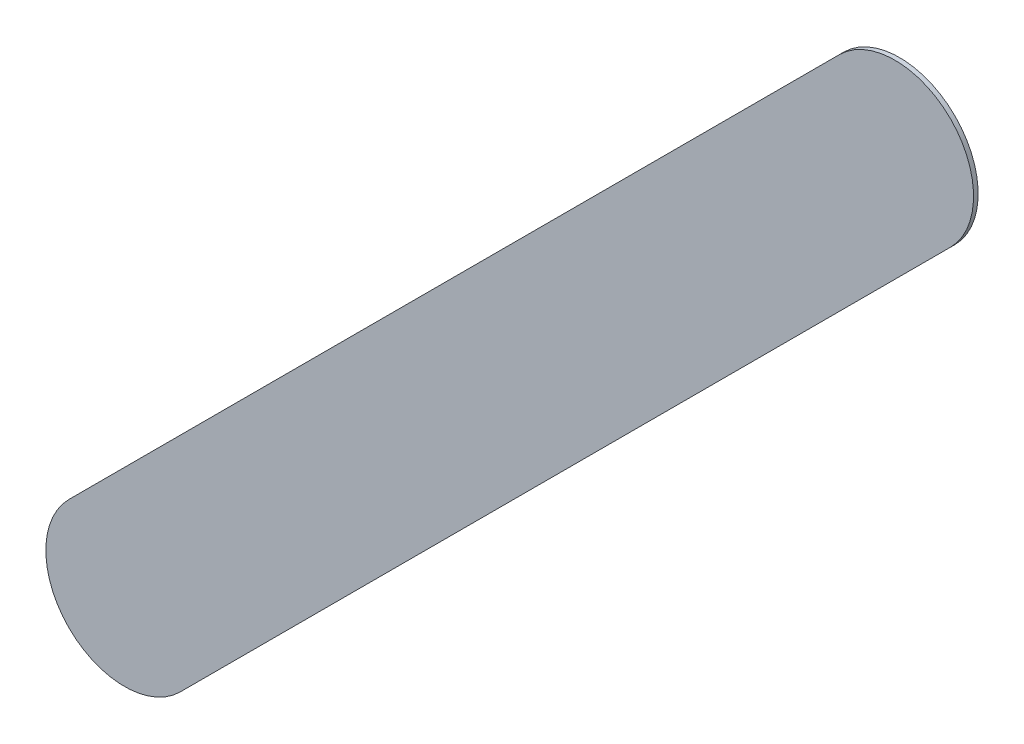
ISO-10303-21;
HEADER;
FILE_DESCRIPTION(('STEP AP214'),'2;1');
FILE_NAME('part.step','',(''),(''),'','','');
FILE_SCHEMA(('AUTOMOTIVE_DESIGN { 1 0 10303 214 1 1 1 1 }'));
ENDSEC;
DATA;
#1=APPLICATION_CONTEXT('core data for automotive mechanical design processes');
#2=APPLICATION_PROTOCOL_DEFINITION('international standard','automotive_design',2000,#1);
#3=PRODUCT_CONTEXT('',#1,'mechanical');
#4=PRODUCT('Part','Part','',(#3));
#5=PRODUCT_RELATED_PRODUCT_CATEGORY('part','',(#4));
#6=PRODUCT_DEFINITION_FORMATION('','',#4);
#7=PRODUCT_DEFINITION_CONTEXT('part definition',#1,'design');
#8=PRODUCT_DEFINITION('design','',#6,#7);
#9=PRODUCT_DEFINITION_SHAPE('','',#8);
#10=(LENGTH_UNIT() NAMED_UNIT(*) SI_UNIT(.MILLI.,.METRE.));
#11=(NAMED_UNIT(*) PLANE_ANGLE_UNIT() SI_UNIT($,.RADIAN.));
#12=(NAMED_UNIT(*) SI_UNIT($,.STERADIAN.) SOLID_ANGLE_UNIT());
#13=UNCERTAINTY_MEASURE_WITH_UNIT(LENGTH_MEASURE(1.E-05),#10,'distance_accuracy_value','');
#14=(GEOMETRIC_REPRESENTATION_CONTEXT(3) GLOBAL_UNCERTAINTY_ASSIGNED_CONTEXT((#13)) GLOBAL_UNIT_ASSIGNED_CONTEXT((#10,
#11,#12)) REPRESENTATION_CONTEXT('',''));
#15=CARTESIAN_POINT('',(0.,0.,0.));
#16=DIRECTION('',(0.,0.,1.));
#17=DIRECTION('',(1.,0.,0.));
#18=AXIS2_PLACEMENT_3D('',#15,#16,#17);
#19=CARTESIAN_POINT('',(2.705735,9.554264,1.635));
#20=DIRECTION('',(0.,0.,1.));
#21=DIRECTION('',(1.,0.,0.));
#22=AXIS2_PLACEMENT_3D('',#19,#20,#21);
#23=PLANE('',#22);
#24=DIRECTION('',(-0.707106721058045,-0.707106841315045,0.));
#25=VECTOR('',#24,1.);
#26=CARTESIAN_POINT('',(2.705735,9.554264,1.635));
#27=LINE('',#26,#25);
#28=CARTESIAN_POINT('',(2.705735,9.554264,1.635));
#29=VERTEX_POINT('',#28);
#30=CARTESIAN_POINT('',(-3.174264,3.674264,1.635));
#31=VERTEX_POINT('',#30);
#32=EDGE_CURVE('E94',#29,#31,#27,.T.);
#33=ORIENTED_EDGE('',*,*,#32,.T.);
#34=CARTESIAN_POINT('',(-2.7499995,3.2499995,1.635));
#35=DIRECTION('',(0.,0.,1.));
#36=DIRECTION('',(-0.707106781186548,0.707106781186548,0.));
#37=AXIS2_PLACEMENT_3D('',#34,#35,#36);
#38=CIRCLE('',#37,0.600000609933);
#39=CARTESIAN_POINT('',(-2.325735,2.825735,1.635));
#40=VERTEX_POINT('',#39);
#41=EDGE_CURVE('E75',#31,#40,#38,.T.);
#42=ORIENTED_EDGE('',*,*,#41,.T.);
#43=DIRECTION('',(0.707106721058045,0.707106841315045,0.));
#44=VECTOR('',#43,1.);
#45=CARTESIAN_POINT('',(-2.325735,2.825735,1.635));
#46=LINE('',#45,#44);
#47=CARTESIAN_POINT('',(3.554264,8.705735,1.635));
#48=VERTEX_POINT('',#47);
#49=EDGE_CURVE('E59',#40,#48,#46,.T.);
#50=ORIENTED_EDGE('',*,*,#49,.T.);
#51=CARTESIAN_POINT('',(3.1299995,9.1299995,1.635));
#52=DIRECTION('',(0.,0.,1.));
#53=DIRECTION('',(0.707106781186548,-0.707106781186548,0.));
#54=AXIS2_PLACEMENT_3D('',#51,#52,#53);
#55=CIRCLE('',#54,0.600000609933);
#56=EDGE_CURVE('E11',#48,#29,#55,.T.);
#57=ORIENTED_EDGE('',*,*,#56,.T.);
#58=EDGE_LOOP('',(#33,#42,#50,#57));
#59=FACE_BOUND('',#58,.T.);
#60=ADVANCED_FACE('F16',(#59),#23,.T.);
#61=CARTESIAN_POINT('',(2.705735,9.554264,1.6));
#62=DIRECTION('',(0.,0.,1.));
#63=DIRECTION('',(1.,0.,0.));
#64=AXIS2_PLACEMENT_3D('',#61,#62,#63);
#65=PLANE('',#64);
#66=CARTESIAN_POINT('',(3.1299995,9.1299995,1.6));
#67=DIRECTION('',(0.,0.,1.));
#68=DIRECTION('',(0.707106781186548,-0.707106781186548,0.));
#69=AXIS2_PLACEMENT_3D('',#66,#67,#68);
#70=CIRCLE('',#69,0.600000609933);
#71=CARTESIAN_POINT('',(3.554264,8.705735,1.6));
#72=VERTEX_POINT('',#71);
#73=CARTESIAN_POINT('',(2.705735,9.554264,1.6));
#74=VERTEX_POINT('',#73);
#75=EDGE_CURVE('E20',#72,#74,#70,.T.);
#76=ORIENTED_EDGE('',*,*,#75,.F.);
#77=DIRECTION('',(0.707106721058045,0.707106841315045,0.));
#78=VECTOR('',#77,1.);
#79=CARTESIAN_POINT('',(-2.325735,2.825735,1.6));
#80=LINE('',#79,#78);
#81=CARTESIAN_POINT('',(-2.325735,2.825735,1.6));
#82=VERTEX_POINT('',#81);
#83=EDGE_CURVE('E67',#82,#72,#80,.T.);
#84=ORIENTED_EDGE('',*,*,#83,.F.);
#85=CARTESIAN_POINT('',(-2.7499995,3.2499995,1.6));
#86=DIRECTION('',(0.,0.,1.));
#87=DIRECTION('',(-0.707106781186548,0.707106781186548,0.));
#88=AXIS2_PLACEMENT_3D('',#85,#86,#87);
#89=CIRCLE('',#88,0.600000609933);
#90=CARTESIAN_POINT('',(-3.174264,3.674264,1.6));
#91=VERTEX_POINT('',#90);
#92=EDGE_CURVE('E71',#91,#82,#89,.T.);
#93=ORIENTED_EDGE('',*,*,#92,.F.);
#94=DIRECTION('',(-0.707106721058045,-0.707106841315045,0.));
#95=VECTOR('',#94,1.);
#96=CARTESIAN_POINT('',(2.705735,9.554264,1.6));
#97=LINE('',#96,#95);
#98=EDGE_CURVE('E102',#74,#91,#97,.T.);
#99=ORIENTED_EDGE('',*,*,#98,.F.);
#100=EDGE_LOOP('',(#76,#84,#93,#99));
#101=FACE_BOUND('',#100,.T.);
#102=ADVANCED_FACE('F68',(#101),#65,.F.);
#103=CARTESIAN_POINT('',(3.1299995,9.1299995,1.6));
#104=DIRECTION('',(0.,0.,-1.));
#105=DIRECTION('',(0.707106781186548,-0.707106781186548,0.));
#106=AXIS2_PLACEMENT_3D('',#103,#104,#105);
#107=CYLINDRICAL_SURFACE('',#106,0.600000609933);
#108=ORIENTED_EDGE('',*,*,#75,.T.);
#109=DIRECTION('',(0.,0.,1.));
#110=VECTOR('',#109,1.);
#111=CARTESIAN_POINT('',(2.705735,9.554264,1.6));
#112=LINE('',#111,#110);
#113=EDGE_CURVE('E88',#74,#29,#112,.T.);
#114=ORIENTED_EDGE('',*,*,#113,.T.);
#115=ORIENTED_EDGE('',*,*,#56,.F.);
#116=DIRECTION('',(0.,0.,1.));
#117=VECTOR('',#116,1.);
#118=CARTESIAN_POINT('',(3.554264,8.705735,1.6));
#119=LINE('',#118,#117);
#120=EDGE_CURVE('E74',#72,#48,#119,.T.);
#121=ORIENTED_EDGE('',*,*,#120,.F.);
#122=EDGE_LOOP('',(#108,#114,#115,#121));
#123=FACE_BOUND('',#122,.T.);
#124=ADVANCED_FACE('F116',(#123),#107,.T.);
#125=CARTESIAN_POINT('',(-2.325735,2.825735,1.6));
#126=DIRECTION('',(-0.707106841315045,0.707106721058045,0.));
#127=DIRECTION('',(0.,0.,1.));
#128=AXIS2_PLACEMENT_3D('',#125,#126,#127);
#129=PLANE('',#128);
#130=ORIENTED_EDGE('',*,*,#83,.T.);
#131=ORIENTED_EDGE('',*,*,#120,.T.);
#132=ORIENTED_EDGE('',*,*,#49,.F.);
#133=DIRECTION('',(0.,0.,1.));
#134=VECTOR('',#133,1.);
#135=CARTESIAN_POINT('',(-2.325735,2.825735,1.6));
#136=LINE('',#135,#134);
#137=EDGE_CURVE('E78',#82,#40,#136,.T.);
#138=ORIENTED_EDGE('',*,*,#137,.F.);
#139=EDGE_LOOP('',(#130,#131,#132,#138));
#140=FACE_BOUND('',#139,.T.);
#141=ADVANCED_FACE('F79',(#140),#129,.F.);
#142=CARTESIAN_POINT('',(-2.7499995,3.2499995,1.6));
#143=DIRECTION('',(0.,0.,-1.));
#144=DIRECTION('',(-0.707106781186548,0.707106781186548,0.));
#145=AXIS2_PLACEMENT_3D('',#142,#143,#144);
#146=CYLINDRICAL_SURFACE('',#145,0.600000609933);
#147=ORIENTED_EDGE('',*,*,#92,.T.);
#148=ORIENTED_EDGE('',*,*,#137,.T.);
#149=ORIENTED_EDGE('',*,*,#41,.F.);
#150=DIRECTION('',(0.,0.,1.));
#151=VECTOR('',#150,1.);
#152=CARTESIAN_POINT('',(-3.174264,3.674264,1.6));
#153=LINE('',#152,#151);
#154=EDGE_CURVE('E85',#91,#31,#153,.T.);
#155=ORIENTED_EDGE('',*,*,#154,.F.);
#156=EDGE_LOOP('',(#147,#148,#149,#155));
#157=FACE_BOUND('',#156,.T.);
#158=ADVANCED_FACE('F18',(#157),#146,.T.);
#159=CARTESIAN_POINT('',(2.705735,9.554264,1.6));
#160=DIRECTION('',(0.707106841315045,-0.707106721058045,0.));
#161=DIRECTION('',(0.,0.,-1.));
#162=AXIS2_PLACEMENT_3D('',#159,#160,#161);
#163=PLANE('',#162);
#164=ORIENTED_EDGE('',*,*,#98,.T.);
#165=ORIENTED_EDGE('',*,*,#154,.T.);
#166=ORIENTED_EDGE('',*,*,#32,.F.);
#167=ORIENTED_EDGE('',*,*,#113,.F.);
#168=EDGE_LOOP('',(#164,#165,#166,#167));
#169=FACE_BOUND('',#168,.T.);
#170=ADVANCED_FACE('F119',(#169),#163,.F.);
#171=CLOSED_SHELL('',(#60,#102,#124,#141,#158,#170));
#172=MANIFOLD_SOLID_BREP('B1',#171);
#173=ADVANCED_BREP_SHAPE_REPRESENTATION('',(#18,#172),#14);
#174=SHAPE_DEFINITION_REPRESENTATION(#9,#173);
ENDSEC;
END-ISO-10303-21;
